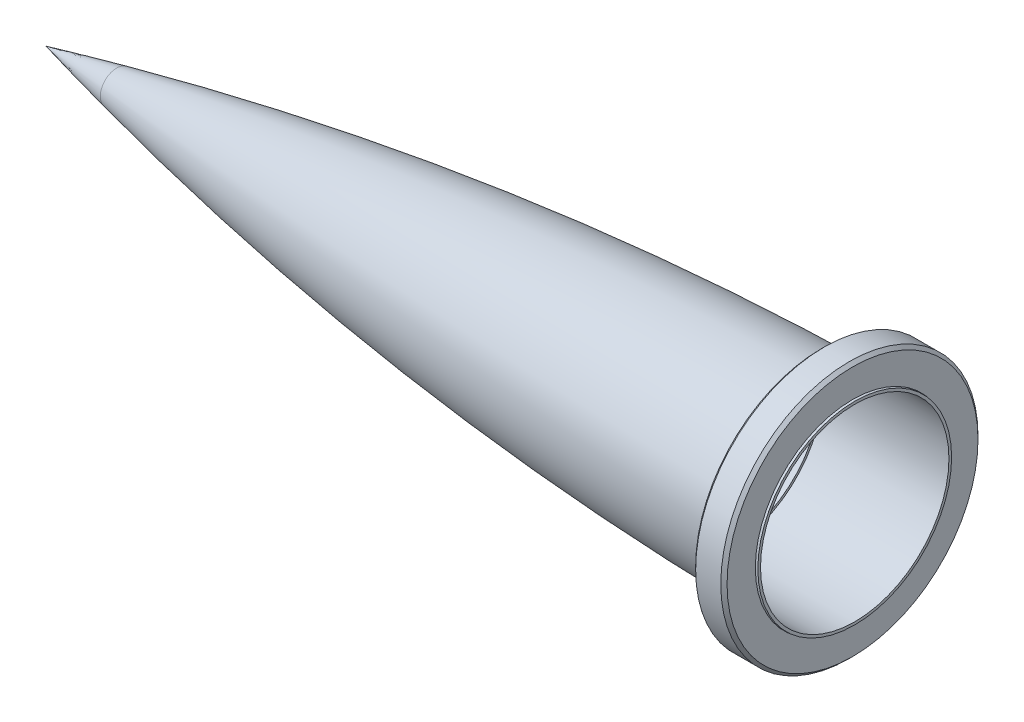
ISO-10303-21;
HEADER;
FILE_DESCRIPTION(('STEP AP214'),'2;1');
FILE_NAME('part.step','',(''),(''),'','','');
FILE_SCHEMA(('AUTOMOTIVE_DESIGN { 1 0 10303 214 1 1 1 1 }'));
ENDSEC;
DATA;
#1=APPLICATION_CONTEXT('core data for automotive mechanical design processes');
#2=APPLICATION_PROTOCOL_DEFINITION('international standard','automotive_design',2000,#1);
#3=PRODUCT_CONTEXT('',#1,'mechanical');
#4=PRODUCT('Part','Part','',(#3));
#5=PRODUCT_RELATED_PRODUCT_CATEGORY('part','',(#4));
#6=PRODUCT_DEFINITION_FORMATION('','',#4);
#7=PRODUCT_DEFINITION_CONTEXT('part definition',#1,'design');
#8=PRODUCT_DEFINITION('design','',#6,#7);
#9=PRODUCT_DEFINITION_SHAPE('','',#8);
#10=(LENGTH_UNIT() NAMED_UNIT(*) SI_UNIT(.MILLI.,.METRE.));
#11=(NAMED_UNIT(*) PLANE_ANGLE_UNIT() SI_UNIT($,.RADIAN.));
#12=(NAMED_UNIT(*) SI_UNIT($,.STERADIAN.) SOLID_ANGLE_UNIT());
#13=UNCERTAINTY_MEASURE_WITH_UNIT(LENGTH_MEASURE(1.E-05),#10,'distance_accuracy_value','');
#14=(GEOMETRIC_REPRESENTATION_CONTEXT(3) GLOBAL_UNCERTAINTY_ASSIGNED_CONTEXT((#13)) GLOBAL_UNIT_ASSIGNED_CONTEXT((#10,
#11,#12)) REPRESENTATION_CONTEXT('',''));
#15=CARTESIAN_POINT('',(0.,0.,0.));
#16=DIRECTION('',(0.,0.,1.));
#17=DIRECTION('',(1.,0.,0.));
#18=AXIS2_PLACEMENT_3D('',#15,#16,#17);
#19=CARTESIAN_POINT('',(654.05,0.,0.));
#20=DIRECTION('',(-1.,0.,0.));
#21=DIRECTION('',(0.,0.,1.));
#22=AXIS2_PLACEMENT_3D('',#19,#20,#21);
#23=DEGENERATE_TOROIDAL_SURFACE('',#22,2690.44570259319,2769.05870259319,.F.);
#24=CARTESIAN_POINT('',(652.272,0.,0.));
#25=DIRECTION('',(-1.,0.,0.));
#26=DIRECTION('',(0.,0.,1.));
#27=AXIS2_PLACEMENT_3D('',#24,#25,#26);
#28=CIRCLE('',#27,78.6124291770833);
#29=CARTESIAN_POINT('',(652.272,0.,78.6124291770833));
#30=VERTEX_POINT('',#29);
#31=EDGE_CURVE('E79',#30,#30,#28,.T.);
#32=ORIENTED_EDGE('',*,*,#31,.F.);
#33=EDGE_LOOP('',(#32));
#34=FACE_BOUND('',#33,.T.);
#35=CARTESIAN_POINT('',(626.872,0.,0.));
#36=DIRECTION('',(-1.,0.,0.));
#37=DIRECTION('',(0.,0.,1.));
#38=AXIS2_PLACEMENT_3D('',#35,#36,#37);
#39=CIRCLE('',#38,78.479622279815);
#40=CARTESIAN_POINT('',(626.872,0.,78.479622279815));
#41=VERTEX_POINT('',#40);
#42=EDGE_CURVE('E82',#41,#41,#39,.T.);
#43=ORIENTED_EDGE('',*,*,#42,.T.);
#44=EDGE_LOOP('',(#43));
#45=FACE_BOUND('',#44,.T.);
#46=ADVANCED_FACE('F58',(#34,#45),#23,.T.);
#47=CARTESIAN_POINT('',(652.272,78.6124291770833,0.));
#48=DIRECTION('',(-1.,0.,0.));
#49=DIRECTION('',(0.,0.,1.));
#50=AXIS2_PLACEMENT_3D('',#47,#48,#49);
#51=PLANE('',#50);
#52=CARTESIAN_POINT('',(652.272,0.,0.));
#53=DIRECTION('',(-1.,0.,0.));
#54=DIRECTION('',(0.,0.,1.));
#55=AXIS2_PLACEMENT_3D('',#52,#53,#54);
#56=CIRCLE('',#55,101.472429177083);
#57=CARTESIAN_POINT('',(652.272,0.,101.472429177083));
#58=VERTEX_POINT('',#57);
#59=EDGE_CURVE('E66',#58,#58,#56,.F.);
#60=ORIENTED_EDGE('',*,*,#59,.T.);
#61=EDGE_LOOP('',(#60));
#62=FACE_BOUND('',#61,.T.);
#63=ORIENTED_EDGE('',*,*,#31,.T.);
#64=EDGE_LOOP('',(#63));
#65=FACE_BOUND('',#64,.T.);
#66=ADVANCED_FACE('F97',(#62,#65),#51,.F.);
#67=CARTESIAN_POINT('',(0.,0.,0.));
#68=DIRECTION('',(-1.,0.,0.));
#69=DIRECTION('',(0.,0.,1.));
#70=AXIS2_PLACEMENT_3D('',#67,#68,#69);
#71=CYLINDRICAL_SURFACE('',#70,104.012429177083);
#72=CARTESIAN_POINT('',(649.732,0.,0.));
#73=DIRECTION('',(-1.,0.,0.));
#74=DIRECTION('',(0.,0.,1.));
#75=AXIS2_PLACEMENT_3D('',#72,#73,#74);
#76=CIRCLE('',#75,104.012429177083);
#77=CARTESIAN_POINT('',(649.732,0.,104.012429177083));
#78=VERTEX_POINT('',#77);
#79=EDGE_CURVE('E70',#78,#78,#76,.T.);
#80=ORIENTED_EDGE('',*,*,#79,.T.);
#81=EDGE_LOOP('',(#80));
#82=FACE_BOUND('',#81,.T.);
#83=CARTESIAN_POINT('',(629.412,0.,0.));
#84=DIRECTION('',(1.,0.,0.));
#85=DIRECTION('',(0.,0.,-1.));
#86=AXIS2_PLACEMENT_3D('',#83,#84,#85);
#87=CIRCLE('',#86,104.012429177083);
#88=CARTESIAN_POINT('',(629.412,0.,-104.012429177083));
#89=VERTEX_POINT('',#88);
#90=EDGE_CURVE('E74',#89,#89,#87,.T.);
#91=ORIENTED_EDGE('',*,*,#90,.T.);
#92=EDGE_LOOP('',(#91));
#93=FACE_BOUND('',#92,.T.);
#94=ADVANCED_FACE('F90',(#82,#93),#71,.T.);
#95=CARTESIAN_POINT('',(626.872,78.479622279815,0.));
#96=DIRECTION('',(1.,0.,0.));
#97=DIRECTION('',(0.,0.,-1.));
#98=AXIS2_PLACEMENT_3D('',#95,#96,#97);
#99=PLANE('',#98);
#100=CARTESIAN_POINT('',(626.872,0.,0.));
#101=DIRECTION('',(1.,0.,0.));
#102=DIRECTION('',(0.,0.,-1.));
#103=AXIS2_PLACEMENT_3D('',#100,#101,#102);
#104=CIRCLE('',#103,101.472429177083);
#105=CARTESIAN_POINT('',(626.872,0.,-101.472429177083));
#106=VERTEX_POINT('',#105);
#107=EDGE_CURVE('E11',#106,#106,#104,.F.);
#108=ORIENTED_EDGE('',*,*,#107,.T.);
#109=EDGE_LOOP('',(#108));
#110=FACE_BOUND('',#109,.T.);
#111=ORIENTED_EDGE('',*,*,#42,.F.);
#112=EDGE_LOOP('',(#111));
#113=FACE_BOUND('',#112,.T.);
#114=ADVANCED_FACE('F87',(#110,#113),#99,.F.);
#115=CARTESIAN_POINT('',(649.732,0.,0.));
#116=DIRECTION('',(-1.,0.,0.));
#117=DIRECTION('',(0.,0.,1.));
#118=AXIS2_PLACEMENT_3D('',#115,#116,#117);
#119=CONICAL_SURFACE('',#118,104.012429177083,0.78539816339744);
#120=ORIENTED_EDGE('',*,*,#59,.F.);
#121=EDGE_LOOP('',(#120));
#122=FACE_BOUND('',#121,.T.);
#123=ORIENTED_EDGE('',*,*,#79,.F.);
#124=EDGE_LOOP('',(#123));
#125=FACE_BOUND('',#124,.T.);
#126=ADVANCED_FACE('F89',(#122,#125),#119,.T.);
#127=CARTESIAN_POINT('',(626.872,0.,0.));
#128=DIRECTION('',(1.,0.,0.));
#129=DIRECTION('',(0.,0.,-1.));
#130=AXIS2_PLACEMENT_3D('',#127,#128,#129);
#131=CONICAL_SURFACE('',#130,101.472429177083,0.785398163397451);
#132=ORIENTED_EDGE('',*,*,#90,.F.);
#133=EDGE_LOOP('',(#132));
#134=FACE_BOUND('',#133,.T.);
#135=ORIENTED_EDGE('',*,*,#107,.F.);
#136=EDGE_LOOP('',(#135));
#137=FACE_BOUND('',#136,.T.);
#138=ADVANCED_FACE('F61',(#134,#137),#131,.T.);
#139=CLOSED_SHELL('',(#46,#66,#94,#114,#126,#138));
#140=MANIFOLD_SOLID_BREP('B2',#139);
#141=CARTESIAN_POINT('',(57.15,-1.49603900363795E-13,0.));
#142=DIRECTION('',(-1.,0.,0.));
#143=DIRECTION('',(0.,0.,1.));
#144=AXIS2_PLACEMENT_3D('',#141,#142,#143);
#145=PLANE('',#144);
#146=CARTESIAN_POINT('',(57.15,0.,0.));
#147=DIRECTION('',(1.,0.,0.));
#148=DIRECTION('',(0.,0.,-1.));
#149=AXIS2_PLACEMENT_3D('',#146,#147,#148);
#150=CIRCLE('',#149,2.5527);
#151=CARTESIAN_POINT('',(57.15,0.,-2.5527));
#152=VERTEX_POINT('',#151);
#153=EDGE_CURVE('E185',#152,#152,#150,.T.);
#154=ORIENTED_EDGE('',*,*,#153,.F.);
#155=EDGE_LOOP('',(#154));
#156=FACE_BOUND('',#155,.T.);
#157=CARTESIAN_POINT('',(57.15,0.,0.));
#158=DIRECTION('',(-1.,0.,0.));
#159=DIRECTION('',(0.,0.,1.));
#160=AXIS2_PLACEMENT_3D('',#157,#158,#159);
#161=CIRCLE('',#160,13.2535911712188);
#162=CARTESIAN_POINT('',(57.15,0.,13.2535911712188));
#163=VERTEX_POINT('',#162);
#164=EDGE_CURVE('E56',#163,#163,#161,.T.);
#165=ORIENTED_EDGE('',*,*,#164,.F.);
#166=EDGE_LOOP('',(#165));
#167=FACE_BOUND('',#166,.T.);
#168=ADVANCED_FACE('F163',(#156,#167),#145,.F.);
#169=CARTESIAN_POINT('',(654.05,0.,-2690.44570259319));
#170=DIRECTION('',(0.,-1.,0.));
#171=DIRECTION('',(0.,0.,1.));
#172=AXIS2_PLACEMENT_3D('',#169,#170,#171);
#173=CIRCLE('',#172,2768.80470259319);
#174=TRIMMED_CURVE('',#173,(PARAMETER_VALUE(-0.238475006580752)),
(PARAMETER_VALUE(0.238475006580752)),.T.,.PARAMETER.);
#175=CARTESIAN_POINT('',(654.05,0.,0.));
#176=DIRECTION('',(-1.,0.,0.));
#177=AXIS1_PLACEMENT('',#175,#176);
#178=SURFACE_OF_REVOLUTION('',#174,#177);
#179=CARTESIAN_POINT('',(0.,0.,0.));
#180=VERTEX_POINT('',#179);
#181=VERTEX_LOOP('',#180);
#182=FACE_BOUND('',#181,.T.);
#183=ORIENTED_EDGE('',*,*,#164,.T.);
#184=EDGE_LOOP('',(#183));
#185=FACE_BOUND('',#184,.T.);
#186=ADVANCED_FACE('F172',(#182,#185),#178,.T.);
#187=CARTESIAN_POINT('',(31.75,0.,0.));
#188=DIRECTION('',(1.,0.,0.));
#189=DIRECTION('',(0.,0.,-1.));
#190=AXIS2_PLACEMENT_3D('',#187,#188,#189);
#191=CYLINDRICAL_SURFACE('',#190,2.5527);
#192=CARTESIAN_POINT('',(31.75,0.,0.));
#193=DIRECTION('',(1.,0.,0.));
#194=DIRECTION('',(0.,0.,-1.));
#195=AXIS2_PLACEMENT_3D('',#192,#193,#194);
#196=CIRCLE('',#195,2.5527);
#197=CARTESIAN_POINT('',(31.75,0.,-2.5527));
#198=VERTEX_POINT('',#197);
#199=EDGE_CURVE('E169',#198,#198,#196,.T.);
#200=ORIENTED_EDGE('',*,*,#199,.F.);
#201=EDGE_LOOP('',(#200));
#202=FACE_BOUND('',#201,.T.);
#203=ORIENTED_EDGE('',*,*,#153,.T.);
#204=EDGE_LOOP('',(#203));
#205=FACE_BOUND('',#204,.T.);
#206=ADVANCED_FACE('F175',(#202,#205),#191,.F.);
#207=CARTESIAN_POINT('',(31.75,0.,0.));
#208=DIRECTION('',(1.,0.,0.));
#209=DIRECTION('',(0.,0.,-1.));
#210=AXIS2_PLACEMENT_3D('',#207,#208,#209);
#211=PLANE('',#210);
#212=ORIENTED_EDGE('',*,*,#199,.T.);
#213=EDGE_LOOP('',(#212));
#214=FACE_BOUND('',#213,.T.);
#215=ADVANCED_FACE('F191',(#214),#211,.T.);
#216=CLOSED_SHELL('',(#168,#186,#206,#215));
#217=MANIFOLD_SOLID_BREP('B6',#216);
#218=CARTESIAN_POINT('',(654.05,0.,0.));
#219=DIRECTION('',(-1.,0.,0.));
#220=DIRECTION('',(0.,0.,1.));
#221=AXIS2_PLACEMENT_3D('',#218,#219,#220);
#222=DEGENERATE_TOROIDAL_SURFACE('',#221,2690.44570259319,2766.64570259319,.F.);
#223=CARTESIAN_POINT('',(57.15,0.,0.));
#224=DIRECTION('',(-1.,0.,0.));
#225=DIRECTION('',(0.,0.,1.));
#226=AXIS2_PLACEMENT_3D('',#223,#224,#225);
#227=CIRCLE('',#226,11.0425601385522);
#228=CARTESIAN_POINT('',(57.15,0.,11.0425601385522));
#229=VERTEX_POINT('',#228);
#230=EDGE_CURVE('E232',#229,#229,#227,.T.);
#231=ORIENTED_EDGE('',*,*,#230,.T.);
#232=EDGE_LOOP('',(#231));
#233=FACE_BOUND('',#232,.T.);
#234=CARTESIAN_POINT('',(552.45,0.,0.));
#235=DIRECTION('',(1.,0.,0.));
#236=DIRECTION('',(0.,0.,-1.));
#237=AXIS2_PLACEMENT_3D('',#234,#235,#236);
#238=CIRCLE('',#237,74.3338335863886);
#239=CARTESIAN_POINT('',(552.45,0.,-74.3338335863886));
#240=VERTEX_POINT('',#239);
#241=EDGE_CURVE('E224',#240,#240,#238,.T.);
#242=ORIENTED_EDGE('',*,*,#241,.T.);
#243=EDGE_LOOP('',(#242));
#244=FACE_BOUND('',#243,.T.);
#245=ADVANCED_FACE('F220',(#233,#244),#222,.T.);
#246=CARTESIAN_POINT('',(654.05,0.,0.));
#247=DIRECTION('',(-1.,0.,0.));
#248=DIRECTION('',(0.,0.,1.));
#249=AXIS2_PLACEMENT_3D('',#246,#247,#248);
#250=PLANE('',#249);
#251=CARTESIAN_POINT('',(654.05,0.,0.));
#252=DIRECTION('',(1.,0.,0.));
#253=DIRECTION('',(0.,0.,-1.));
#254=AXIS2_PLACEMENT_3D('',#251,#252,#253);
#255=CIRCLE('',#254,76.2);
#256=CARTESIAN_POINT('',(654.05,0.,-76.2));
#257=VERTEX_POINT('',#256);
#258=EDGE_CURVE('E237',#257,#257,#255,.T.);
#259=ORIENTED_EDGE('',*,*,#258,.F.);
#260=EDGE_LOOP('',(#259));
#261=FACE_BOUND('',#260,.T.);
#262=CARTESIAN_POINT('',(654.05,0.,0.));
#263=DIRECTION('',(-1.,0.,0.));
#264=DIRECTION('',(0.,0.,1.));
#265=AXIS2_PLACEMENT_3D('',#262,#263,#264);
#266=CIRCLE('',#265,78.359);
#267=CARTESIAN_POINT('',(654.05,0.,78.359));
#268=VERTEX_POINT('',#267);
#269=EDGE_CURVE('E162',#268,#268,#266,.T.);
#270=ORIENTED_EDGE('',*,*,#269,.F.);
#271=EDGE_LOOP('',(#270));
#272=FACE_BOUND('',#271,.T.);
#273=ADVANCED_FACE('F222',(#261,#272),#250,.F.);
#274=CARTESIAN_POINT('',(654.05,0.,0.));
#275=DIRECTION('',(-1.,0.,0.));
#276=DIRECTION('',(0.,0.,1.));
#277=AXIS2_PLACEMENT_3D('',#274,#275,#276);
#278=DEGENERATE_TOROIDAL_SURFACE('',#277,2690.44570259319,2768.80470259319,.F.);
#279=CARTESIAN_POINT('',(57.15,0.,0.));
#280=DIRECTION('',(-1.,0.,0.));
#281=DIRECTION('',(0.,0.,1.));
#282=AXIS2_PLACEMENT_3D('',#279,#280,#281);
#283=CIRCLE('',#282,13.2535911712188);
#284=CARTESIAN_POINT('',(57.15,0.,13.2535911712188));
#285=VERTEX_POINT('',#284);
#286=EDGE_CURVE('E228',#285,#285,#283,.T.);
#287=ORIENTED_EDGE('',*,*,#286,.F.);
#288=EDGE_LOOP('',(#287));
#289=FACE_BOUND('',#288,.T.);
#290=ORIENTED_EDGE('',*,*,#269,.T.);
#291=EDGE_LOOP('',(#290));
#292=FACE_BOUND('',#291,.T.);
#293=ADVANCED_FACE('F265',(#289,#292),#278,.F.);
#294=CARTESIAN_POINT('',(57.15,-1.49603900363795E-13,0.));
#295=DIRECTION('',(-1.,0.,0.));
#296=DIRECTION('',(0.,0.,1.));
#297=AXIS2_PLACEMENT_3D('',#294,#295,#296);
#298=PLANE('',#297);
#299=ORIENTED_EDGE('',*,*,#230,.F.);
#300=EDGE_LOOP('',(#299));
#301=FACE_BOUND('',#300,.T.);
#302=ORIENTED_EDGE('',*,*,#286,.T.);
#303=EDGE_LOOP('',(#302));
#304=FACE_BOUND('',#303,.T.);
#305=ADVANCED_FACE('F255',(#301,#304),#298,.T.);
#306=CARTESIAN_POINT('',(552.45,0.,0.));
#307=DIRECTION('',(1.,0.,0.));
#308=DIRECTION('',(0.,0.,-1.));
#309=AXIS2_PLACEMENT_3D('',#306,#307,#308);
#310=CYLINDRICAL_SURFACE('',#309,76.2);
#311=CARTESIAN_POINT('',(552.45,0.,0.));
#312=DIRECTION('',(1.,0.,0.));
#313=DIRECTION('',(0.,0.,-1.));
#314=AXIS2_PLACEMENT_3D('',#311,#312,#313);
#315=CIRCLE('',#314,76.2);
#316=CARTESIAN_POINT('',(552.45,0.,-76.2));
#317=VERTEX_POINT('',#316);
#318=EDGE_CURVE('E240',#317,#317,#315,.T.);
#319=ORIENTED_EDGE('',*,*,#318,.F.);
#320=EDGE_LOOP('',(#319));
#321=FACE_BOUND('',#320,.T.);
#322=ORIENTED_EDGE('',*,*,#258,.T.);
#323=EDGE_LOOP('',(#322));
#324=FACE_BOUND('',#323,.T.);
#325=ADVANCED_FACE('F250',(#321,#324),#310,.F.);
#326=CARTESIAN_POINT('',(552.45,0.,0.));
#327=DIRECTION('',(1.,0.,0.));
#328=DIRECTION('',(0.,0.,-1.));
#329=AXIS2_PLACEMENT_3D('',#326,#327,#328);
#330=PLANE('',#329);
#331=ORIENTED_EDGE('',*,*,#241,.F.);
#332=EDGE_LOOP('',(#331));
#333=FACE_BOUND('',#332,.T.);
#334=ORIENTED_EDGE('',*,*,#318,.T.);
#335=EDGE_LOOP('',(#334));
#336=FACE_BOUND('',#335,.T.);
#337=ADVANCED_FACE('F248',(#333,#336),#330,.T.);
#338=CLOSED_SHELL('',(#245,#273,#293,#305,#325,#337));
#339=MANIFOLD_SOLID_BREP('B50',#338);
#340=ADVANCED_BREP_SHAPE_REPRESENTATION('',(#18,#140,#217,#339),#14);
#341=SHAPE_DEFINITION_REPRESENTATION(#9,#340);
ENDSEC;
END-ISO-10303-21;
